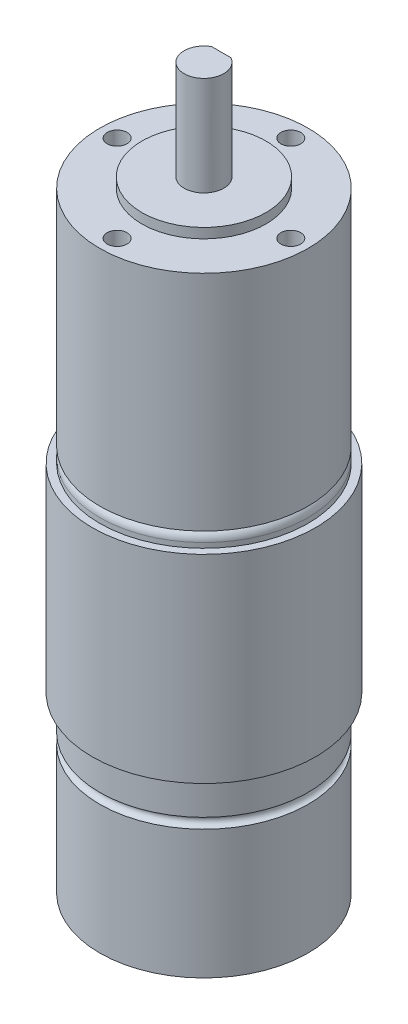
ISO-10303-21;
HEADER;
FILE_DESCRIPTION(('STEP AP214'),'2;1');
FILE_NAME('part.step','',(''),(''),'','','');
FILE_SCHEMA(('AUTOMOTIVE_DESIGN { 1 0 10303 214 1 1 1 1 }'));
ENDSEC;
DATA;
#1=APPLICATION_CONTEXT('core data for automotive mechanical design processes');
#2=APPLICATION_PROTOCOL_DEFINITION('international standard','automotive_design',2000,#1);
#3=PRODUCT_CONTEXT('',#1,'mechanical');
#4=PRODUCT('Part','Part','',(#3));
#5=PRODUCT_RELATED_PRODUCT_CATEGORY('part','',(#4));
#6=PRODUCT_DEFINITION_FORMATION('','',#4);
#7=PRODUCT_DEFINITION_CONTEXT('part definition',#1,'design');
#8=PRODUCT_DEFINITION('design','',#6,#7);
#9=PRODUCT_DEFINITION_SHAPE('','',#8);
#10=(LENGTH_UNIT() NAMED_UNIT(*) SI_UNIT(.MILLI.,.METRE.));
#11=(NAMED_UNIT(*) PLANE_ANGLE_UNIT() SI_UNIT($,.RADIAN.));
#12=(NAMED_UNIT(*) SI_UNIT($,.STERADIAN.) SOLID_ANGLE_UNIT());
#13=UNCERTAINTY_MEASURE_WITH_UNIT(LENGTH_MEASURE(1.E-05),#10,'distance_accuracy_value','');
#14=(GEOMETRIC_REPRESENTATION_CONTEXT(3) GLOBAL_UNCERTAINTY_ASSIGNED_CONTEXT((#13)) GLOBAL_UNIT_ASSIGNED_CONTEXT((#10,
#11,#12)) REPRESENTATION_CONTEXT('',''));
#15=CARTESIAN_POINT('',(0.,0.,0.));
#16=DIRECTION('',(0.,0.,1.));
#17=DIRECTION('',(1.,0.,0.));
#18=AXIS2_PLACEMENT_3D('',#15,#16,#17);
#19=CARTESIAN_POINT('',(0.,27.,0.));
#20=DIRECTION('',(0.,1.,0.));
#21=DIRECTION('',(0.,0.,1.));
#22=AXIS2_PLACEMENT_3D('',#19,#20,#21);
#23=TOROIDAL_SURFACE('',#22,21.,1.03908280135346);
#24=CARTESIAN_POINT('',(0.,25.9609171986465,0.));
#25=DIRECTION('',(0.,1.,0.));
#26=DIRECTION('',(0.,0.,1.));
#27=AXIS2_PLACEMENT_3D('',#24,#25,#26);
#28=CIRCLE('',#27,21.);
#29=CARTESIAN_POINT('',(0.,25.9609171986465,21.));
#30=VERTEX_POINT('',#29);
#31=EDGE_CURVE('E86',#30,#30,#28,.T.);
#32=ORIENTED_EDGE('',*,*,#31,.T.);
#33=EDGE_LOOP('',(#32));
#34=FACE_BOUND('',#33,.T.);
#35=CARTESIAN_POINT('',(0.,28.0390828013534,0.));
#36=DIRECTION('',(0.,1.,0.));
#37=DIRECTION('',(0.,0.,1.));
#38=AXIS2_PLACEMENT_3D('',#35,#36,#37);
#39=CIRCLE('',#38,21.);
#40=CARTESIAN_POINT('',(0.,28.0390828013534,21.));
#41=VERTEX_POINT('',#40);
#42=EDGE_CURVE('E13',#41,#41,#39,.T.);
#43=ORIENTED_EDGE('',*,*,#42,.F.);
#44=EDGE_LOOP('',(#43));
#45=FACE_BOUND('',#44,.T.);
#46=ADVANCED_FACE('F48',(#34,#45),#23,.F.);
#47=CARTESIAN_POINT('',(0.,180.020988845701,0.));
#48=DIRECTION('',(0.,1.,0.));
#49=DIRECTION('',(0.,0.,1.));
#50=AXIS2_PLACEMENT_3D('',#47,#48,#49);
#51=CYLINDRICAL_SURFACE('',#50,21.);
#52=ORIENTED_EDGE('',*,*,#42,.T.);
#53=EDGE_LOOP('',(#52));
#54=FACE_BOUND('',#53,.T.);
#55=CARTESIAN_POINT('',(0.,35.,0.));
#56=DIRECTION('',(0.,1.,0.));
#57=DIRECTION('',(0.,0.,1.));
#58=AXIS2_PLACEMENT_3D('',#55,#56,#57);
#59=CIRCLE('',#58,21.);
#60=CARTESIAN_POINT('',(0.,35.,21.));
#61=VERTEX_POINT('',#60);
#62=EDGE_CURVE('E55',#61,#61,#59,.T.);
#63=ORIENTED_EDGE('',*,*,#62,.F.);
#64=EDGE_LOOP('',(#63));
#65=FACE_BOUND('',#64,.T.);
#66=ADVANCED_FACE('F130',(#54,#65),#51,.T.);
#67=CARTESIAN_POINT('',(-1.61907524424502E-13,35.,0.));
#68=DIRECTION('',(0.,-1.,0.));
#69=DIRECTION('',(0.,0.,-1.));
#70=AXIS2_PLACEMENT_3D('',#67,#68,#69);
#71=PLANE('',#70);
#72=ORIENTED_EDGE('',*,*,#62,.T.);
#73=EDGE_LOOP('',(#72));
#74=FACE_BOUND('',#73,.T.);
#75=CARTESIAN_POINT('',(0.,35.,0.));
#76=DIRECTION('',(0.,1.,0.));
#77=DIRECTION('',(0.,0.,1.));
#78=AXIS2_PLACEMENT_3D('',#75,#76,#77);
#79=CIRCLE('',#78,22.5);
#80=CARTESIAN_POINT('',(0.,35.,22.5));
#81=VERTEX_POINT('',#80);
#82=EDGE_CURVE('E122',#81,#81,#79,.T.);
#83=ORIENTED_EDGE('',*,*,#82,.F.);
#84=EDGE_LOOP('',(#83));
#85=FACE_BOUND('',#84,.T.);
#86=ADVANCED_FACE('F127',(#74,#85),#71,.T.);
#87=CARTESIAN_POINT('',(0.,180.020988845701,0.));
#88=DIRECTION('',(0.,1.,0.));
#89=DIRECTION('',(0.,0.,1.));
#90=AXIS2_PLACEMENT_3D('',#87,#88,#89);
#91=CYLINDRICAL_SURFACE('',#90,22.5);
#92=ORIENTED_EDGE('',*,*,#82,.T.);
#93=EDGE_LOOP('',(#92));
#94=FACE_BOUND('',#93,.T.);
#95=CARTESIAN_POINT('',(0.,75.,0.));
#96=DIRECTION('',(0.,1.,0.));
#97=DIRECTION('',(0.,0.,1.));
#98=AXIS2_PLACEMENT_3D('',#95,#96,#97);
#99=CIRCLE('',#98,22.5);
#100=CARTESIAN_POINT('',(0.,75.,22.5));
#101=VERTEX_POINT('',#100);
#102=EDGE_CURVE('E119',#101,#101,#99,.T.);
#103=ORIENTED_EDGE('',*,*,#102,.F.);
#104=EDGE_LOOP('',(#103));
#105=FACE_BOUND('',#104,.T.);
#106=ADVANCED_FACE('F137',(#94,#105),#91,.T.);
#107=CARTESIAN_POINT('',(0.,75.,0.));
#108=DIRECTION('',(0.,1.,0.));
#109=DIRECTION('',(0.,0.,1.));
#110=AXIS2_PLACEMENT_3D('',#107,#108,#109);
#111=PLANE('',#110);
#112=ORIENTED_EDGE('',*,*,#102,.T.);
#113=EDGE_LOOP('',(#112));
#114=FACE_BOUND('',#113,.T.);
#115=CARTESIAN_POINT('',(0.,75.,0.));
#116=DIRECTION('',(0.,1.,0.));
#117=DIRECTION('',(0.,0.,1.));
#118=AXIS2_PLACEMENT_3D('',#115,#116,#117);
#119=CIRCLE('',#118,21.);
#120=CARTESIAN_POINT('',(0.,75.,21.));
#121=VERTEX_POINT('',#120);
#122=EDGE_CURVE('E116',#121,#121,#119,.T.);
#123=ORIENTED_EDGE('',*,*,#122,.F.);
#124=EDGE_LOOP('',(#123));
#125=FACE_BOUND('',#124,.T.);
#126=ADVANCED_FACE('F143',(#114,#125),#111,.T.);
#127=CARTESIAN_POINT('',(0.,180.020988845701,0.));
#128=DIRECTION('',(0.,1.,0.));
#129=DIRECTION('',(0.,0.,1.));
#130=AXIS2_PLACEMENT_3D('',#127,#128,#129);
#131=CYLINDRICAL_SURFACE('',#130,21.);
#132=ORIENTED_EDGE('',*,*,#122,.T.);
#133=EDGE_LOOP('',(#132));
#134=FACE_BOUND('',#133,.T.);
#135=CARTESIAN_POINT('',(0.,76.,0.));
#136=DIRECTION('',(0.,1.,0.));
#137=DIRECTION('',(0.,0.,1.));
#138=AXIS2_PLACEMENT_3D('',#135,#136,#137);
#139=CIRCLE('',#138,21.);
#140=CARTESIAN_POINT('',(0.,76.,21.));
#141=VERTEX_POINT('',#140);
#142=EDGE_CURVE('E113',#141,#141,#139,.T.);
#143=ORIENTED_EDGE('',*,*,#142,.F.);
#144=EDGE_LOOP('',(#143));
#145=FACE_BOUND('',#144,.T.);
#146=ADVANCED_FACE('F147',(#134,#145),#131,.T.);
#147=CARTESIAN_POINT('',(0.,76.,0.));
#148=DIRECTION('',(0.,1.,0.));
#149=DIRECTION('',(0.,0.,1.));
#150=AXIS2_PLACEMENT_3D('',#147,#148,#149);
#151=TOROIDAL_SURFACE('',#150,19.,2.);
#152=CARTESIAN_POINT('',(0.,78.,0.));
#153=DIRECTION('',(0.,1.,0.));
#154=DIRECTION('',(0.,0.,1.));
#155=AXIS2_PLACEMENT_3D('',#152,#153,#154);
#156=CIRCLE('',#155,19.);
#157=CARTESIAN_POINT('',(0.,78.,19.));
#158=VERTEX_POINT('',#157);
#159=EDGE_CURVE('E110',#158,#158,#156,.T.);
#160=ORIENTED_EDGE('',*,*,#159,.F.);
#161=EDGE_LOOP('',(#160));
#162=FACE_BOUND('',#161,.T.);
#163=ORIENTED_EDGE('',*,*,#142,.T.);
#164=EDGE_LOOP('',(#163));
#165=FACE_BOUND('',#164,.T.);
#166=ADVANCED_FACE('F151',(#162,#165),#151,.T.);
#167=CARTESIAN_POINT('',(0.,78.,0.));
#168=DIRECTION('',(0.,-1.,0.));
#169=DIRECTION('',(0.,0.,-1.));
#170=AXIS2_PLACEMENT_3D('',#167,#168,#169);
#171=PLANE('',#170);
#172=ORIENTED_EDGE('',*,*,#159,.T.);
#173=EDGE_LOOP('',(#172));
#174=FACE_BOUND('',#173,.T.);
#175=CARTESIAN_POINT('',(0.,78.,0.));
#176=DIRECTION('',(0.,1.,0.));
#177=DIRECTION('',(0.,0.,1.));
#178=AXIS2_PLACEMENT_3D('',#175,#176,#177);
#179=CIRCLE('',#178,21.);
#180=CARTESIAN_POINT('',(0.,78.,21.));
#181=VERTEX_POINT('',#180);
#182=EDGE_CURVE('E107',#181,#181,#179,.T.);
#183=ORIENTED_EDGE('',*,*,#182,.F.);
#184=EDGE_LOOP('',(#183));
#185=FACE_BOUND('',#184,.T.);
#186=ADVANCED_FACE('F155',(#174,#185),#171,.T.);
#187=CARTESIAN_POINT('',(0.,180.020988845701,0.));
#188=DIRECTION('',(0.,1.,0.));
#189=DIRECTION('',(0.,0.,1.));
#190=AXIS2_PLACEMENT_3D('',#187,#188,#189);
#191=CYLINDRICAL_SURFACE('',#190,21.);
#192=ORIENTED_EDGE('',*,*,#182,.T.);
#193=EDGE_LOOP('',(#192));
#194=FACE_BOUND('',#193,.T.);
#195=CARTESIAN_POINT('',(0.,123.,0.));
#196=DIRECTION('',(0.,1.,0.));
#197=DIRECTION('',(0.,0.,1.));
#198=AXIS2_PLACEMENT_3D('',#195,#196,#197);
#199=CIRCLE('',#198,21.);
#200=CARTESIAN_POINT('',(0.,123.,21.));
#201=VERTEX_POINT('',#200);
#202=EDGE_CURVE('E104',#201,#201,#199,.T.);
#203=ORIENTED_EDGE('',*,*,#202,.F.);
#204=EDGE_LOOP('',(#203));
#205=FACE_BOUND('',#204,.T.);
#206=ADVANCED_FACE('F159',(#194,#205),#191,.T.);
#207=CARTESIAN_POINT('',(0.,123.,0.));
#208=DIRECTION('',(0.,1.,0.));
#209=DIRECTION('',(0.,0.,1.));
#210=AXIS2_PLACEMENT_3D('',#207,#208,#209);
#211=PLANE('',#210);
#212=CARTESIAN_POINT('',(0.,123.,-17.5));
#213=DIRECTION('',(0.,1.,0.));
#214=DIRECTION('',(0.,0.,1.));
#215=AXIS2_PLACEMENT_3D('',#212,#213,#214);
#216=CIRCLE('',#215,2.);
#217=CARTESIAN_POINT('',(0.,123.,-15.5));
#218=VERTEX_POINT('',#217);
#219=EDGE_CURVE('E229',#218,#218,#216,.T.);
#220=ORIENTED_EDGE('',*,*,#219,.F.);
#221=EDGE_LOOP('',(#220));
#222=FACE_BOUND('',#221,.T.);
#223=CARTESIAN_POINT('',(17.5000000000005,123.,-4.95236783133562E-13));
#224=DIRECTION('',(0.,1.,0.));
#225=DIRECTION('',(0.,0.,1.));
#226=AXIS2_PLACEMENT_3D('',#223,#224,#225);
#227=CIRCLE('',#226,2.00000000000039);
#228=CARTESIAN_POINT('',(17.5000000000005,123.,1.99999999999989));
#229=VERTEX_POINT('',#228);
#230=EDGE_CURVE('E237',#229,#229,#227,.T.);
#231=ORIENTED_EDGE('',*,*,#230,.F.);
#232=EDGE_LOOP('',(#231));
#233=FACE_BOUND('',#232,.T.);
#234=CARTESIAN_POINT('',(9.90473566267125E-13,123.,17.5));
#235=DIRECTION('',(0.,1.,0.));
#236=DIRECTION('',(0.,0.,1.));
#237=AXIS2_PLACEMENT_3D('',#234,#235,#236);
#238=CIRCLE('',#237,2.00000000000107);
#239=CARTESIAN_POINT('',(9.90473566267125E-13,123.,19.5000000000011));
#240=VERTEX_POINT('',#239);
#241=EDGE_CURVE('E243',#240,#240,#238,.T.);
#242=ORIENTED_EDGE('',*,*,#241,.F.);
#243=EDGE_LOOP('',(#242));
#244=FACE_BOUND('',#243,.T.);
#245=CARTESIAN_POINT('',(-17.4999999999995,123.,4.9737991503207E-13));
#246=DIRECTION('',(0.,1.,0.));
#247=DIRECTION('',(0.,0.,1.));
#248=AXIS2_PLACEMENT_3D('',#245,#246,#247);
#249=CIRCLE('',#248,2.0000000000008);
#250=CARTESIAN_POINT('',(-17.4999999999995,123.,2.00000000000129));
#251=VERTEX_POINT('',#250);
#252=EDGE_CURVE('E249',#251,#251,#249,.T.);
#253=ORIENTED_EDGE('',*,*,#252,.F.);
#254=EDGE_LOOP('',(#253));
#255=FACE_BOUND('',#254,.T.);
#256=ORIENTED_EDGE('',*,*,#202,.T.);
#257=EDGE_LOOP('',(#256));
#258=FACE_BOUND('',#257,.T.);
#259=CARTESIAN_POINT('',(0.,123.,0.));
#260=DIRECTION('',(0.,1.,0.));
#261=DIRECTION('',(0.,0.,1.));
#262=AXIS2_PLACEMENT_3D('',#259,#260,#261);
#263=CIRCLE('',#262,12.5);
#264=CARTESIAN_POINT('',(0.,123.,12.5));
#265=VERTEX_POINT('',#264);
#266=EDGE_CURVE('E101',#265,#265,#263,.T.);
#267=ORIENTED_EDGE('',*,*,#266,.F.);
#268=EDGE_LOOP('',(#267));
#269=FACE_BOUND('',#268,.T.);
#270=ADVANCED_FACE('F163',(#222,#233,#244,#255,#258,#269),#211,.T.);
#271=CARTESIAN_POINT('',(0.,180.020988845701,0.));
#272=DIRECTION('',(0.,1.,0.));
#273=DIRECTION('',(0.,0.,1.));
#274=AXIS2_PLACEMENT_3D('',#271,#272,#273);
#275=CYLINDRICAL_SURFACE('',#274,12.5);
#276=ORIENTED_EDGE('',*,*,#266,.T.);
#277=EDGE_LOOP('',(#276));
#278=FACE_BOUND('',#277,.T.);
#279=CARTESIAN_POINT('',(0.,125.,0.));
#280=DIRECTION('',(0.,1.,0.));
#281=DIRECTION('',(0.,0.,1.));
#282=AXIS2_PLACEMENT_3D('',#279,#280,#281);
#283=CIRCLE('',#282,12.5);
#284=CARTESIAN_POINT('',(0.,125.,12.5));
#285=VERTEX_POINT('',#284);
#286=EDGE_CURVE('E93',#285,#285,#283,.T.);
#287=ORIENTED_EDGE('',*,*,#286,.F.);
#288=EDGE_LOOP('',(#287));
#289=FACE_BOUND('',#288,.T.);
#290=ADVANCED_FACE('F167',(#278,#289),#275,.T.);
#291=CARTESIAN_POINT('',(0.,125.,0.));
#292=DIRECTION('',(0.,1.,0.));
#293=DIRECTION('',(0.,0.,1.));
#294=AXIS2_PLACEMENT_3D('',#291,#292,#293);
#295=PLANE('',#294);
#296=ORIENTED_EDGE('',*,*,#286,.T.);
#297=EDGE_LOOP('',(#296));
#298=FACE_BOUND('',#297,.T.);
#299=CARTESIAN_POINT('',(0.,125.,0.));
#300=DIRECTION('',(0.,1.,0.));
#301=DIRECTION('',(0.,0.,1.));
#302=AXIS2_PLACEMENT_3D('',#299,#300,#301);
#303=CIRCLE('',#302,4.);
#304=CARTESIAN_POINT('',(0.,125.,4.));
#305=VERTEX_POINT('',#304);
#306=EDGE_CURVE('E89',#305,#305,#303,.T.);
#307=ORIENTED_EDGE('',*,*,#306,.F.);
#308=EDGE_LOOP('',(#307));
#309=FACE_BOUND('',#308,.T.);
#310=ADVANCED_FACE('F171',(#298,#309),#295,.T.);
#311=CARTESIAN_POINT('',(0.,180.020988845701,0.));
#312=DIRECTION('',(0.,1.,0.));
#313=DIRECTION('',(0.,0.,1.));
#314=AXIS2_PLACEMENT_3D('',#311,#312,#313);
#315=CYLINDRICAL_SURFACE('',#314,4.);
#316=DIRECTION('',(0.,1.,0.));
#317=VECTOR('',#316,1.);
#318=CARTESIAN_POINT('',(1.93649167310371,133.,-3.5));
#319=LINE('',#318,#317);
#320=CARTESIAN_POINT('',(1.93649167310371,133.,-3.5));
#321=VERTEX_POINT('',#320);
#322=CARTESIAN_POINT('',(1.93649167310371,145.,-3.5));
#323=VERTEX_POINT('',#322);
#324=EDGE_CURVE('E68',#321,#323,#319,.T.);
#325=ORIENTED_EDGE('',*,*,#324,.T.);
#326=CARTESIAN_POINT('',(0.,145.,0.));
#327=DIRECTION('',(0.,1.,0.));
#328=DIRECTION('',(0.,0.,1.));
#329=AXIS2_PLACEMENT_3D('',#326,#327,#328);
#330=CIRCLE('',#329,4.);
#331=CARTESIAN_POINT('',(-1.93649167310371,145.,-3.5));
#332=VERTEX_POINT('',#331);
#333=EDGE_CURVE('E85',#332,#323,#330,.T.);
#334=ORIENTED_EDGE('',*,*,#333,.F.);
#335=DIRECTION('',(0.,1.,0.));
#336=VECTOR('',#335,1.);
#337=CARTESIAN_POINT('',(-1.93649167310371,133.,-3.5));
#338=LINE('',#337,#336);
#339=CARTESIAN_POINT('',(-1.93649167310371,133.,-3.5));
#340=VERTEX_POINT('',#339);
#341=EDGE_CURVE('E62',#340,#332,#338,.T.);
#342=ORIENTED_EDGE('',*,*,#341,.F.);
#343=CARTESIAN_POINT('',(0.,133.,0.));
#344=DIRECTION('',(0.,1.,0.));
#345=DIRECTION('',(0.,0.,1.));
#346=AXIS2_PLACEMENT_3D('',#343,#344,#345);
#347=CIRCLE('',#346,4.);
#348=EDGE_CURVE('E78',#321,#340,#347,.T.);
#349=ORIENTED_EDGE('',*,*,#348,.F.);
#350=EDGE_LOOP('',(#325,#334,#342,#349));
#351=FACE_BOUND('',#350,.T.);
#352=ORIENTED_EDGE('',*,*,#306,.T.);
#353=EDGE_LOOP('',(#352));
#354=FACE_BOUND('',#353,.T.);
#355=ADVANCED_FACE('F83',(#351,#354),#315,.T.);
#356=CARTESIAN_POINT('',(0.,145.,0.));
#357=DIRECTION('',(0.,1.,0.));
#358=DIRECTION('',(0.,0.,1.));
#359=AXIS2_PLACEMENT_3D('',#356,#357,#358);
#360=PLANE('',#359);
#361=DIRECTION('',(1.,0.,0.));
#362=VECTOR('',#361,1.);
#363=CARTESIAN_POINT('',(-1.93649167310371,145.,-3.5));
#364=LINE('',#363,#362);
#365=EDGE_CURVE('E73',#332,#323,#364,.T.);
#366=ORIENTED_EDGE('',*,*,#365,.F.);
#367=ORIENTED_EDGE('',*,*,#333,.T.);
#368=EDGE_LOOP('',(#366,#367));
#369=FACE_BOUND('',#368,.T.);
#370=ADVANCED_FACE('F88',(#369),#360,.T.);
#371=CARTESIAN_POINT('',(0.,0.,0.));
#372=DIRECTION('',(0.,-1.,0.));
#373=DIRECTION('',(0.,0.,-1.));
#374=AXIS2_PLACEMENT_3D('',#371,#372,#373);
#375=PLANE('',#374);
#376=CARTESIAN_POINT('',(0.,0.,0.));
#377=DIRECTION('',(0.,1.,0.));
#378=DIRECTION('',(0.,0.,1.));
#379=AXIS2_PLACEMENT_3D('',#376,#377,#378);
#380=CIRCLE('',#379,21.);
#381=CARTESIAN_POINT('',(0.,0.,21.));
#382=VERTEX_POINT('',#381);
#383=EDGE_CURVE('E90',#382,#382,#380,.T.);
#384=ORIENTED_EDGE('',*,*,#383,.F.);
#385=EDGE_LOOP('',(#384));
#386=FACE_BOUND('',#385,.T.);
#387=ADVANCED_FACE('F180',(#386),#375,.T.);
#388=CARTESIAN_POINT('',(0.,180.020988845701,0.));
#389=DIRECTION('',(0.,1.,0.));
#390=DIRECTION('',(0.,0.,1.));
#391=AXIS2_PLACEMENT_3D('',#388,#389,#390);
#392=CYLINDRICAL_SURFACE('',#391,21.);
#393=ORIENTED_EDGE('',*,*,#383,.T.);
#394=EDGE_LOOP('',(#393));
#395=FACE_BOUND('',#394,.T.);
#396=ORIENTED_EDGE('',*,*,#31,.F.);
#397=EDGE_LOOP('',(#396));
#398=FACE_BOUND('',#397,.T.);
#399=ADVANCED_FACE('F183',(#395,#398),#392,.T.);
#400=CARTESIAN_POINT('',(-1.93649167310371,133.,-3.5));
#401=DIRECTION('',(0.,0.,1.));
#402=DIRECTION('',(1.,0.,0.));
#403=AXIS2_PLACEMENT_3D('',#400,#401,#402);
#404=PLANE('',#403);
#405=ORIENTED_EDGE('',*,*,#365,.T.);
#406=ORIENTED_EDGE('',*,*,#324,.F.);
#407=DIRECTION('',(1.,0.,0.));
#408=VECTOR('',#407,1.);
#409=CARTESIAN_POINT('',(-1.93649167310371,133.,-3.5));
#410=LINE('',#409,#408);
#411=EDGE_CURVE('E253',#340,#321,#410,.T.);
#412=ORIENTED_EDGE('',*,*,#411,.F.);
#413=ORIENTED_EDGE('',*,*,#341,.T.);
#414=EDGE_LOOP('',(#405,#406,#412,#413));
#415=FACE_BOUND('',#414,.T.);
#416=ADVANCED_FACE('F74',(#415),#404,.F.);
#417=CARTESIAN_POINT('',(0.,133.,0.));
#418=DIRECTION('',(0.,1.,0.));
#419=DIRECTION('',(0.,0.,1.));
#420=AXIS2_PLACEMENT_3D('',#417,#418,#419);
#421=PLANE('',#420);
#422=ORIENTED_EDGE('',*,*,#348,.T.);
#423=ORIENTED_EDGE('',*,*,#411,.T.);
#424=EDGE_LOOP('',(#422,#423));
#425=FACE_BOUND('',#424,.T.);
#426=ADVANCED_FACE('F190',(#425),#421,.T.);
#427=CARTESIAN_POINT('',(-17.4999999999995,119.,4.9737991503207E-13));
#428=DIRECTION('',(0.,1.,0.));
#429=DIRECTION('',(0.,0.,1.));
#430=AXIS2_PLACEMENT_3D('',#427,#428,#429);
#431=CYLINDRICAL_SURFACE('',#430,2.0000000000008);
#432=CARTESIAN_POINT('',(-17.4999999999995,119.,4.9737991503207E-13));
#433=DIRECTION('',(0.,1.,0.));
#434=DIRECTION('',(0.,0.,1.));
#435=AXIS2_PLACEMENT_3D('',#432,#433,#434);
#436=CIRCLE('',#435,2.0000000000008);
#437=CARTESIAN_POINT('',(-17.4999999999995,119.,2.00000000000129));
#438=VERTEX_POINT('',#437);
#439=EDGE_CURVE('E246',#438,#438,#436,.T.);
#440=ORIENTED_EDGE('',*,*,#439,.F.);
#441=EDGE_LOOP('',(#440));
#442=FACE_BOUND('',#441,.T.);
#443=ORIENTED_EDGE('',*,*,#252,.T.);
#444=EDGE_LOOP('',(#443));
#445=FACE_BOUND('',#444,.T.);
#446=ADVANCED_FACE('F193',(#442,#445),#431,.F.);
#447=CARTESIAN_POINT('',(-17.4999999999995,119.,4.9737991503207E-13));
#448=DIRECTION('',(0.,1.,0.));
#449=DIRECTION('',(0.,0.,1.));
#450=AXIS2_PLACEMENT_3D('',#447,#448,#449);
#451=PLANE('',#450);
#452=ORIENTED_EDGE('',*,*,#439,.T.);
#453=EDGE_LOOP('',(#452));
#454=FACE_BOUND('',#453,.T.);
#455=ADVANCED_FACE('F197',(#454),#451,.T.);
#456=CARTESIAN_POINT('',(9.90473566267125E-13,119.,17.5));
#457=DIRECTION('',(0.,1.,0.));
#458=DIRECTION('',(0.,0.,1.));
#459=AXIS2_PLACEMENT_3D('',#456,#457,#458);
#460=CYLINDRICAL_SURFACE('',#459,2.00000000000107);
#461=CARTESIAN_POINT('',(9.90473566267125E-13,119.,17.5));
#462=DIRECTION('',(0.,1.,0.));
#463=DIRECTION('',(0.,0.,1.));
#464=AXIS2_PLACEMENT_3D('',#461,#462,#463);
#465=CIRCLE('',#464,2.00000000000107);
#466=CARTESIAN_POINT('',(9.90473566267125E-13,119.,19.5000000000011));
#467=VERTEX_POINT('',#466);
#468=EDGE_CURVE('E240',#467,#467,#465,.T.);
#469=ORIENTED_EDGE('',*,*,#468,.F.);
#470=EDGE_LOOP('',(#469));
#471=FACE_BOUND('',#470,.T.);
#472=ORIENTED_EDGE('',*,*,#241,.T.);
#473=EDGE_LOOP('',(#472));
#474=FACE_BOUND('',#473,.T.);
#475=ADVANCED_FACE('F201',(#471,#474),#460,.F.);
#476=CARTESIAN_POINT('',(9.90473566267125E-13,119.,17.5));
#477=DIRECTION('',(0.,1.,0.));
#478=DIRECTION('',(0.,0.,1.));
#479=AXIS2_PLACEMENT_3D('',#476,#477,#478);
#480=PLANE('',#479);
#481=ORIENTED_EDGE('',*,*,#468,.T.);
#482=EDGE_LOOP('',(#481));
#483=FACE_BOUND('',#482,.T.);
#484=ADVANCED_FACE('F205',(#483),#480,.T.);
#485=CARTESIAN_POINT('',(17.5000000000005,119.,-4.95236783133562E-13));
#486=DIRECTION('',(0.,1.,0.));
#487=DIRECTION('',(0.,0.,1.));
#488=AXIS2_PLACEMENT_3D('',#485,#486,#487);
#489=CYLINDRICAL_SURFACE('',#488,2.00000000000039);
#490=CARTESIAN_POINT('',(17.5000000000005,119.,-4.95236783133562E-13));
#491=DIRECTION('',(0.,1.,0.));
#492=DIRECTION('',(0.,0.,1.));
#493=AXIS2_PLACEMENT_3D('',#490,#491,#492);
#494=CIRCLE('',#493,2.00000000000039);
#495=CARTESIAN_POINT('',(17.5000000000005,119.,1.99999999999989));
#496=VERTEX_POINT('',#495);
#497=EDGE_CURVE('E232',#496,#496,#494,.T.);
#498=ORIENTED_EDGE('',*,*,#497,.F.);
#499=EDGE_LOOP('',(#498));
#500=FACE_BOUND('',#499,.T.);
#501=ORIENTED_EDGE('',*,*,#230,.T.);
#502=EDGE_LOOP('',(#501));
#503=FACE_BOUND('',#502,.T.);
#504=ADVANCED_FACE('F209',(#500,#503),#489,.F.);
#505=CARTESIAN_POINT('',(17.5000000000005,119.,-4.95236783133562E-13));
#506=DIRECTION('',(0.,1.,0.));
#507=DIRECTION('',(0.,0.,1.));
#508=AXIS2_PLACEMENT_3D('',#505,#506,#507);
#509=PLANE('',#508);
#510=ORIENTED_EDGE('',*,*,#497,.T.);
#511=EDGE_LOOP('',(#510));
#512=FACE_BOUND('',#511,.T.);
#513=ADVANCED_FACE('F213',(#512),#509,.T.);
#514=CARTESIAN_POINT('',(0.,119.,-17.5));
#515=DIRECTION('',(0.,1.,0.));
#516=DIRECTION('',(0.,0.,1.));
#517=AXIS2_PLACEMENT_3D('',#514,#515,#516);
#518=CYLINDRICAL_SURFACE('',#517,2.);
#519=CARTESIAN_POINT('',(0.,119.,-17.5));
#520=DIRECTION('',(0.,1.,0.));
#521=DIRECTION('',(0.,0.,1.));
#522=AXIS2_PLACEMENT_3D('',#519,#520,#521);
#523=CIRCLE('',#522,2.);
#524=CARTESIAN_POINT('',(0.,119.,-15.5));
#525=VERTEX_POINT('',#524);
#526=EDGE_CURVE('E79',#525,#525,#523,.T.);
#527=ORIENTED_EDGE('',*,*,#526,.F.);
#528=EDGE_LOOP('',(#527));
#529=FACE_BOUND('',#528,.T.);
#530=ORIENTED_EDGE('',*,*,#219,.T.);
#531=EDGE_LOOP('',(#530));
#532=FACE_BOUND('',#531,.T.);
#533=ADVANCED_FACE('F217',(#529,#532),#518,.F.);
#534=CARTESIAN_POINT('',(0.,119.,-17.5));
#535=DIRECTION('',(0.,1.,0.));
#536=DIRECTION('',(0.,0.,1.));
#537=AXIS2_PLACEMENT_3D('',#534,#535,#536);
#538=PLANE('',#537);
#539=ORIENTED_EDGE('',*,*,#526,.T.);
#540=EDGE_LOOP('',(#539));
#541=FACE_BOUND('',#540,.T.);
#542=ADVANCED_FACE('F221',(#541),#538,.T.);
#543=CLOSED_SHELL('',(#46,#66,#86,#106,#126,#146,#166,#186,#206,#270,#290,#310,#355,#370,#387,
#399,#416,#426,#446,#455,#475,#484,#504,#513,#533,#542));
#544=MANIFOLD_SOLID_BREP('B2',#543);
#545=ADVANCED_BREP_SHAPE_REPRESENTATION('',(#18,#544),#14);
#546=SHAPE_DEFINITION_REPRESENTATION(#9,#545);
ENDSEC;
END-ISO-10303-21;
